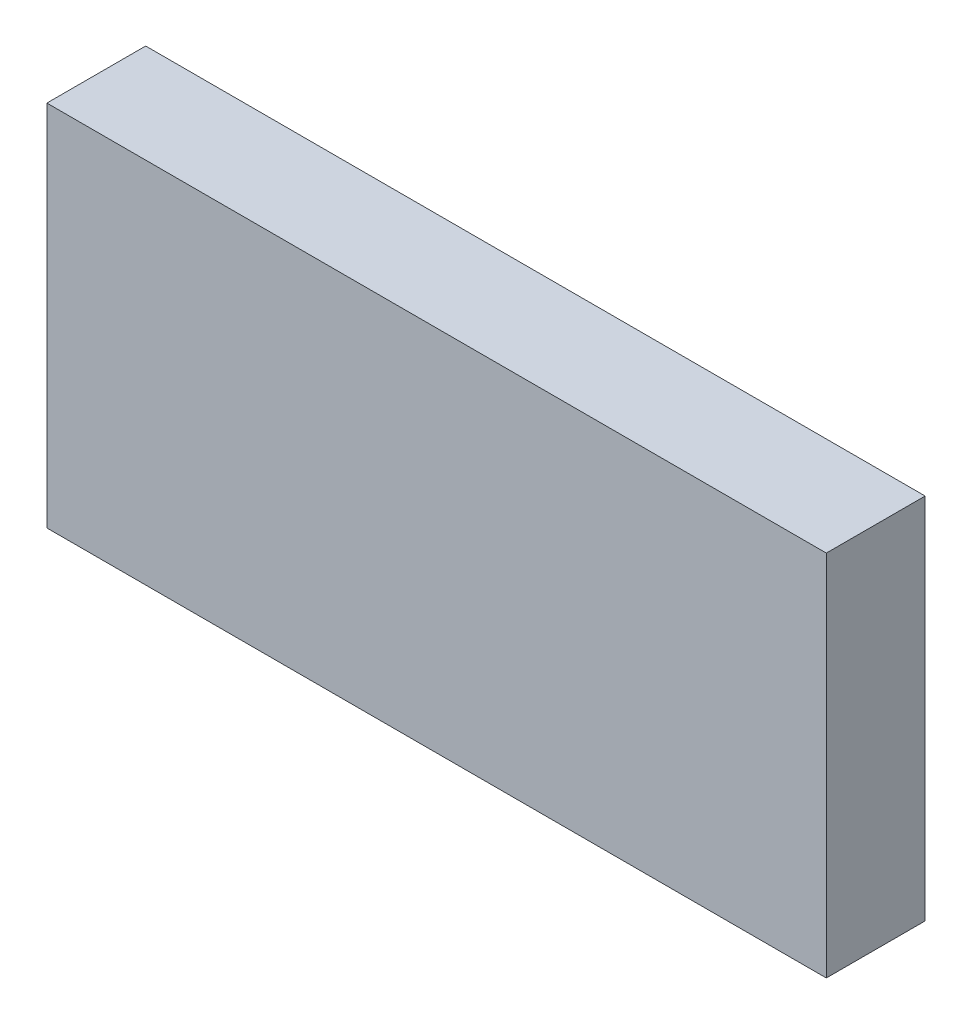
ISO-10303-21;
HEADER;
FILE_DESCRIPTION(('STEP AP214'),'2;1');
FILE_NAME('part.step','',(''),(''),'','','');
FILE_SCHEMA(('AUTOMOTIVE_DESIGN { 1 0 10303 214 1 1 1 1 }'));
ENDSEC;
DATA;
#1=APPLICATION_CONTEXT('core data for automotive mechanical design processes');
#2=APPLICATION_PROTOCOL_DEFINITION('international standard','automotive_design',2000,#1);
#3=PRODUCT_CONTEXT('',#1,'mechanical');
#4=PRODUCT('Part','Part','',(#3));
#5=PRODUCT_RELATED_PRODUCT_CATEGORY('part','',(#4));
#6=PRODUCT_DEFINITION_FORMATION('','',#4);
#7=PRODUCT_DEFINITION_CONTEXT('part definition',#1,'design');
#8=PRODUCT_DEFINITION('design','',#6,#7);
#9=PRODUCT_DEFINITION_SHAPE('','',#8);
#10=(LENGTH_UNIT() NAMED_UNIT(*) SI_UNIT(.MILLI.,.METRE.));
#11=(NAMED_UNIT(*) PLANE_ANGLE_UNIT() SI_UNIT($,.RADIAN.));
#12=(NAMED_UNIT(*) SI_UNIT($,.STERADIAN.) SOLID_ANGLE_UNIT());
#13=UNCERTAINTY_MEASURE_WITH_UNIT(LENGTH_MEASURE(1.E-05),#10,'distance_accuracy_value','');
#14=(GEOMETRIC_REPRESENTATION_CONTEXT(3) GLOBAL_UNCERTAINTY_ASSIGNED_CONTEXT((#13)) GLOBAL_UNIT_ASSIGNED_CONTEXT((#10,
#11,#12)) REPRESENTATION_CONTEXT('',''));
#15=CARTESIAN_POINT('',(0.,0.,0.));
#16=DIRECTION('',(0.,0.,1.));
#17=DIRECTION('',(1.,0.,0.));
#18=AXIS2_PLACEMENT_3D('',#15,#16,#17);
#19=CARTESIAN_POINT('',(0.,0.15875,0.));
#20=DIRECTION('',(0.,0.,1.));
#21=DIRECTION('',(1.,0.,0.));
#22=AXIS2_PLACEMENT_3D('',#19,#20,#21);
#23=PLANE('',#22);
#24=DIRECTION('',(-1.,0.,0.));
#25=VECTOR('',#24,1.);
#26=CARTESIAN_POINT('',(4.58631049774124,-2.0066,0.));
#27=LINE('',#26,#25);
#28=CARTESIAN_POINT('',(4.58631049774124,-2.0066,0.));
#29=VERTEX_POINT('',#28);
#30=CARTESIAN_POINT('',(-4.58631049774124,-2.0066,0.));
#31=VERTEX_POINT('',#30);
#32=EDGE_CURVE('E27',#29,#31,#27,.T.);
#33=ORIENTED_EDGE('',*,*,#32,.T.);
#34=DIRECTION('',(0.,1.,0.));
#35=VECTOR('',#34,1.);
#36=CARTESIAN_POINT('',(-4.58631049774124,-2.0066,0.));
#37=LINE('',#36,#35);
#38=CARTESIAN_POINT('',(-4.58631049774124,2.3241,0.));
#39=VERTEX_POINT('',#38);
#40=EDGE_CURVE('E88',#31,#39,#37,.T.);
#41=ORIENTED_EDGE('',*,*,#40,.T.);
#42=DIRECTION('',(1.,0.,0.));
#43=VECTOR('',#42,1.);
#44=CARTESIAN_POINT('',(-4.58631049774124,2.3241,0.));
#45=LINE('',#44,#43);
#46=CARTESIAN_POINT('',(4.58631049774124,2.3241,0.));
#47=VERTEX_POINT('',#46);
#48=EDGE_CURVE('E81',#39,#47,#45,.T.);
#49=ORIENTED_EDGE('',*,*,#48,.T.);
#50=DIRECTION('',(0.,-1.,0.));
#51=VECTOR('',#50,1.);
#52=CARTESIAN_POINT('',(4.58631049774124,2.3241,0.));
#53=LINE('',#52,#51);
#54=EDGE_CURVE('E68',#47,#29,#53,.T.);
#55=ORIENTED_EDGE('',*,*,#54,.T.);
#56=EDGE_LOOP('',(#33,#41,#49,#55));
#57=FACE_BOUND('',#56,.T.);
#58=ADVANCED_FACE('F16',(#57),#23,.F.);
#59=CARTESIAN_POINT('',(0.,0.15875,1.163));
#60=DIRECTION('',(0.,0.,1.));
#61=DIRECTION('',(1.,0.,0.));
#62=AXIS2_PLACEMENT_3D('',#59,#60,#61);
#63=PLANE('',#62);
#64=DIRECTION('',(1.,0.,0.));
#65=VECTOR('',#64,1.);
#66=CARTESIAN_POINT('',(4.58631049774124,-2.0066,1.163));
#67=LINE('',#66,#65);
#68=CARTESIAN_POINT('',(-4.58631049774124,-2.0066,1.163));
#69=VERTEX_POINT('',#68);
#70=CARTESIAN_POINT('',(4.58631049774124,-2.0066,1.163));
#71=VERTEX_POINT('',#70);
#72=EDGE_CURVE('E11',#69,#71,#67,.T.);
#73=ORIENTED_EDGE('',*,*,#72,.T.);
#74=DIRECTION('',(0.,1.,0.));
#75=VECTOR('',#74,1.);
#76=CARTESIAN_POINT('',(4.58631049774124,2.3241,1.163));
#77=LINE('',#76,#75);
#78=CARTESIAN_POINT('',(4.58631049774124,2.3241,1.163));
#79=VERTEX_POINT('',#78);
#80=EDGE_CURVE('E20',#71,#79,#77,.T.);
#81=ORIENTED_EDGE('',*,*,#80,.T.);
#82=DIRECTION('',(-1.,0.,0.));
#83=VECTOR('',#82,1.);
#84=CARTESIAN_POINT('',(-4.58631049774124,2.3241,1.163));
#85=LINE('',#84,#83);
#86=CARTESIAN_POINT('',(-4.58631049774124,2.3241,1.163));
#87=VERTEX_POINT('',#86);
#88=EDGE_CURVE('E83',#79,#87,#85,.T.);
#89=ORIENTED_EDGE('',*,*,#88,.T.);
#90=DIRECTION('',(0.,-1.,0.));
#91=VECTOR('',#90,1.);
#92=CARTESIAN_POINT('',(-4.58631049774124,-2.0066,1.163));
#93=LINE('',#92,#91);
#94=EDGE_CURVE('E98',#87,#69,#93,.T.);
#95=ORIENTED_EDGE('',*,*,#94,.T.);
#96=EDGE_LOOP('',(#73,#81,#89,#95));
#97=FACE_BOUND('',#96,.T.);
#98=ADVANCED_FACE('F127',(#97),#63,.T.);
#99=CARTESIAN_POINT('',(-4.58631049774124,-2.0066,0.));
#100=DIRECTION('',(0.,-1.,0.));
#101=DIRECTION('',(-1.,0.,0.));
#102=AXIS2_PLACEMENT_3D('',#99,#100,#101);
#103=PLANE('',#102);
#104=ORIENTED_EDGE('',*,*,#32,.F.);
#105=DIRECTION('',(0.,0.,1.));
#106=VECTOR('',#105,1.);
#107=CARTESIAN_POINT('',(4.58631049774124,-2.0066,0.));
#108=LINE('',#107,#106);
#109=EDGE_CURVE('E73',#29,#71,#108,.T.);
#110=ORIENTED_EDGE('',*,*,#109,.T.);
#111=ORIENTED_EDGE('',*,*,#72,.F.);
#112=DIRECTION('',(0.,0.,1.));
#113=VECTOR('',#112,1.);
#114=CARTESIAN_POINT('',(-4.58631049774124,-2.0066,0.));
#115=LINE('',#114,#113);
#116=EDGE_CURVE('E103',#31,#69,#115,.T.);
#117=ORIENTED_EDGE('',*,*,#116,.F.);
#118=EDGE_LOOP('',(#104,#110,#111,#117));
#119=FACE_BOUND('',#118,.T.);
#120=ADVANCED_FACE('F125',(#119),#103,.T.);
#121=CARTESIAN_POINT('',(4.58631049774124,-2.0066,0.));
#122=DIRECTION('',(1.,0.,0.));
#123=DIRECTION('',(0.,-1.,0.));
#124=AXIS2_PLACEMENT_3D('',#121,#122,#123);
#125=PLANE('',#124);
#126=ORIENTED_EDGE('',*,*,#54,.F.);
#127=DIRECTION('',(0.,0.,1.));
#128=VECTOR('',#127,1.);
#129=CARTESIAN_POINT('',(4.58631049774124,2.3241,0.));
#130=LINE('',#129,#128);
#131=EDGE_CURVE('E71',#47,#79,#130,.T.);
#132=ORIENTED_EDGE('',*,*,#131,.T.);
#133=ORIENTED_EDGE('',*,*,#80,.F.);
#134=ORIENTED_EDGE('',*,*,#109,.F.);
#135=EDGE_LOOP('',(#126,#132,#133,#134));
#136=FACE_BOUND('',#135,.T.);
#137=ADVANCED_FACE('F70',(#136),#125,.T.);
#138=CARTESIAN_POINT('',(4.58631049774124,2.3241,0.));
#139=DIRECTION('',(0.,1.,0.));
#140=DIRECTION('',(1.,0.,0.));
#141=AXIS2_PLACEMENT_3D('',#138,#139,#140);
#142=PLANE('',#141);
#143=ORIENTED_EDGE('',*,*,#48,.F.);
#144=DIRECTION('',(0.,0.,1.));
#145=VECTOR('',#144,1.);
#146=CARTESIAN_POINT('',(-4.58631049774124,2.3241,0.));
#147=LINE('',#146,#145);
#148=EDGE_CURVE('E90',#39,#87,#147,.T.);
#149=ORIENTED_EDGE('',*,*,#148,.T.);
#150=ORIENTED_EDGE('',*,*,#88,.F.);
#151=ORIENTED_EDGE('',*,*,#131,.F.);
#152=EDGE_LOOP('',(#143,#149,#150,#151));
#153=FACE_BOUND('',#152,.T.);
#154=ADVANCED_FACE('F18',(#153),#142,.T.);
#155=CARTESIAN_POINT('',(-4.58631049774124,2.3241,0.));
#156=DIRECTION('',(-1.,0.,0.));
#157=DIRECTION('',(0.,0.,1.));
#158=AXIS2_PLACEMENT_3D('',#155,#156,#157);
#159=PLANE('',#158);
#160=ORIENTED_EDGE('',*,*,#40,.F.);
#161=ORIENTED_EDGE('',*,*,#116,.T.);
#162=ORIENTED_EDGE('',*,*,#94,.F.);
#163=ORIENTED_EDGE('',*,*,#148,.F.);
#164=EDGE_LOOP('',(#160,#161,#162,#163));
#165=FACE_BOUND('',#164,.T.);
#166=ADVANCED_FACE('F124',(#165),#159,.T.);
#167=CLOSED_SHELL('',(#58,#98,#120,#137,#154,#166));
#168=MANIFOLD_SOLID_BREP('B1',#167);
#169=ADVANCED_BREP_SHAPE_REPRESENTATION('',(#18,#168),#14);
#170=SHAPE_DEFINITION_REPRESENTATION(#9,#169);
ENDSEC;
END-ISO-10303-21;
